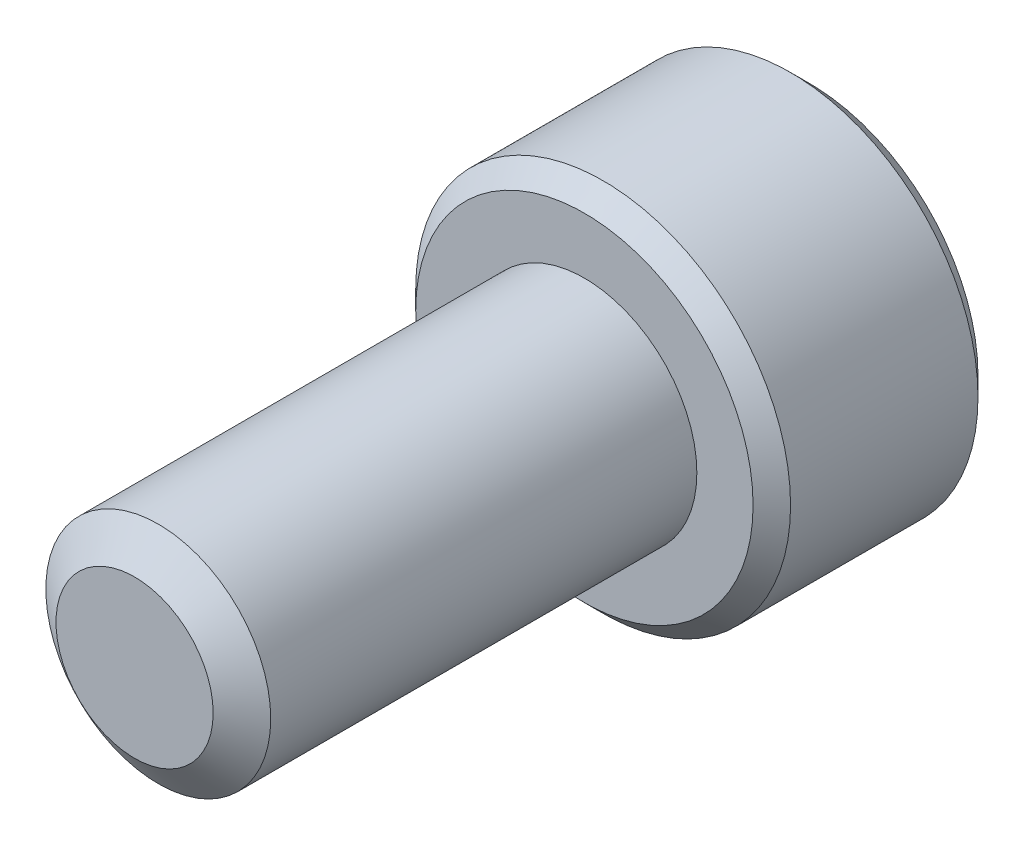
ISO-10303-21;
HEADER;
FILE_DESCRIPTION(('STEP AP214'),'2;1');
FILE_NAME('part.step','',(''),(''),'','','');
FILE_SCHEMA(('AUTOMOTIVE_DESIGN { 1 0 10303 214 1 1 1 1 }'));
ENDSEC;
DATA;
#1=APPLICATION_CONTEXT('core data for automotive mechanical design processes');
#2=APPLICATION_PROTOCOL_DEFINITION('international standard','automotive_design',2000,#1);
#3=PRODUCT_CONTEXT('',#1,'mechanical');
#4=PRODUCT('Part','Part','',(#3));
#5=PRODUCT_RELATED_PRODUCT_CATEGORY('part','',(#4));
#6=PRODUCT_DEFINITION_FORMATION('','',#4);
#7=PRODUCT_DEFINITION_CONTEXT('part definition',#1,'design');
#8=PRODUCT_DEFINITION('design','',#6,#7);
#9=PRODUCT_DEFINITION_SHAPE('','',#8);
#10=(LENGTH_UNIT() NAMED_UNIT(*) SI_UNIT(.MILLI.,.METRE.));
#11=(NAMED_UNIT(*) PLANE_ANGLE_UNIT() SI_UNIT($,.RADIAN.));
#12=(NAMED_UNIT(*) SI_UNIT($,.STERADIAN.) SOLID_ANGLE_UNIT());
#13=UNCERTAINTY_MEASURE_WITH_UNIT(LENGTH_MEASURE(1.E-05),#10,'distance_accuracy_value','');
#14=(GEOMETRIC_REPRESENTATION_CONTEXT(3) GLOBAL_UNCERTAINTY_ASSIGNED_CONTEXT((#13)) GLOBAL_UNIT_ASSIGNED_CONTEXT((#10,
#11,#12)) REPRESENTATION_CONTEXT('',''));
#15=CARTESIAN_POINT('',(0.,0.,0.));
#16=DIRECTION('',(0.,0.,1.));
#17=DIRECTION('',(1.,0.,0.));
#18=AXIS2_PLACEMENT_3D('',#15,#16,#17);
#19=CARTESIAN_POINT('',(0.,0.,-12.));
#20=DIRECTION('',(0.,0.,1.));
#21=DIRECTION('',(1.,0.,0.));
#22=AXIS2_PLACEMENT_3D('',#19,#20,#21);
#23=CYLINDRICAL_SURFACE('',#22,3.);
#24=CARTESIAN_POINT('',(0.,0.,-12.));
#25=DIRECTION('',(0.,0.,-1.));
#26=DIRECTION('',(-1.,0.,0.));
#27=AXIS2_PLACEMENT_3D('',#24,#25,#26);
#28=CIRCLE('',#27,3.);
#29=CARTESIAN_POINT('',(-3.,0.,-12.));
#30=VERTEX_POINT('',#29);
#31=EDGE_CURVE('E218',#30,#30,#28,.F.);
#32=ORIENTED_EDGE('',*,*,#31,.T.);
#33=EDGE_LOOP('',(#32));
#34=FACE_BOUND('',#33,.T.);
#35=CARTESIAN_POINT('',(0.,0.,-0.632650851713494));
#36=DIRECTION('',(0.,0.,1.));
#37=DIRECTION('',(1.,0.,0.));
#38=AXIS2_PLACEMENT_3D('',#35,#36,#37);
#39=CIRCLE('',#38,3.);
#40=CARTESIAN_POINT('',(3.,0.,-0.632650851713494));
#41=VERTEX_POINT('',#40);
#42=EDGE_CURVE('E112',#41,#41,#39,.T.);
#43=ORIENTED_EDGE('',*,*,#42,.F.);
#44=EDGE_LOOP('',(#43));
#45=FACE_BOUND('',#44,.T.);
#46=ADVANCED_FACE('F38',(#34,#45),#23,.T.);
#47=CARTESIAN_POINT('',(0.,0.,0.));
#48=DIRECTION('',(0.,0.,-1.));
#49=DIRECTION('',(-1.,0.,0.));
#50=AXIS2_PLACEMENT_3D('',#47,#48,#49);
#51=CONICAL_SURFACE('',#50,2.09648094716167,0.959931088596884);
#52=ORIENTED_EDGE('',*,*,#42,.T.);
#53=EDGE_LOOP('',(#52));
#54=FACE_BOUND('',#53,.T.);
#55=CARTESIAN_POINT('',(0.,0.,0.));
#56=DIRECTION('',(0.,0.,1.));
#57=DIRECTION('',(1.,0.,0.));
#58=AXIS2_PLACEMENT_3D('',#55,#56,#57);
#59=CIRCLE('',#58,2.09648094716167);
#60=CARTESIAN_POINT('',(2.09648094716167,0.,0.));
#61=VERTEX_POINT('',#60);
#62=EDGE_CURVE('E216',#61,#61,#59,.T.);
#63=ORIENTED_EDGE('',*,*,#62,.F.);
#64=EDGE_LOOP('',(#63));
#65=FACE_BOUND('',#64,.T.);
#66=ADVANCED_FACE('F199',(#54,#65),#51,.T.);
#67=CARTESIAN_POINT('',(0.,0.,0.));
#68=DIRECTION('',(0.,0.,1.));
#69=DIRECTION('',(1.,0.,0.));
#70=AXIS2_PLACEMENT_3D('',#67,#68,#69);
#71=PLANE('',#70);
#72=ORIENTED_EDGE('',*,*,#62,.T.);
#73=EDGE_LOOP('',(#72));
#74=FACE_BOUND('',#73,.T.);
#75=ADVANCED_FACE('F196',(#74),#71,.T.);
#76=CARTESIAN_POINT('',(0.,0.,-18.));
#77=DIRECTION('',(0.,0.,1.));
#78=DIRECTION('',(1.,0.,0.));
#79=AXIS2_PLACEMENT_3D('',#76,#77,#78);
#80=CYLINDRICAL_SURFACE('',#79,5.);
#81=CARTESIAN_POINT('',(0.,0.,-17.5));
#82=DIRECTION('',(0.,0.,-1.));
#83=DIRECTION('',(-1.,0.,0.));
#84=AXIS2_PLACEMENT_3D('',#81,#82,#83);
#85=CIRCLE('',#84,5.);
#86=CARTESIAN_POINT('',(-5.,0.,-17.5));
#87=VERTEX_POINT('',#86);
#88=EDGE_CURVE('E46',#87,#87,#85,.F.);
#89=ORIENTED_EDGE('',*,*,#88,.T.);
#90=EDGE_LOOP('',(#89));
#91=FACE_BOUND('',#90,.T.);
#92=CARTESIAN_POINT('',(0.,0.,-12.5));
#93=DIRECTION('',(0.,0.,-1.));
#94=DIRECTION('',(-1.,0.,0.));
#95=AXIS2_PLACEMENT_3D('',#92,#93,#94);
#96=CIRCLE('',#95,5.);
#97=CARTESIAN_POINT('',(-5.,0.,-12.5));
#98=VERTEX_POINT('',#97);
#99=EDGE_CURVE('E175',#98,#98,#96,.T.);
#100=ORIENTED_EDGE('',*,*,#99,.T.);
#101=EDGE_LOOP('',(#100));
#102=FACE_BOUND('',#101,.T.);
#103=ADVANCED_FACE('F180',(#91,#102),#80,.T.);
#104=CARTESIAN_POINT('',(0.,0.,-18.));
#105=DIRECTION('',(0.,0.,-1.));
#106=DIRECTION('',(-1.,0.,0.));
#107=AXIS2_PLACEMENT_3D('',#104,#105,#106);
#108=PLANE('',#107);
#109=CARTESIAN_POINT('',(0.,0.,-18.));
#110=DIRECTION('',(0.,0.,-1.));
#111=DIRECTION('',(-1.,0.,0.));
#112=AXIS2_PLACEMENT_3D('',#109,#110,#111);
#113=CIRCLE('',#112,4.5);
#114=CARTESIAN_POINT('',(-4.5,0.,-18.));
#115=VERTEX_POINT('',#114);
#116=EDGE_CURVE('E111',#115,#115,#113,.T.);
#117=ORIENTED_EDGE('',*,*,#116,.T.);
#118=EDGE_LOOP('',(#117));
#119=FACE_BOUND('',#118,.T.);
#120=CARTESIAN_POINT('',(0.,0.,-18.));
#121=DIRECTION('',(0.,0.,-1.));
#122=DIRECTION('',(-1.,0.,0.));
#123=AXIS2_PLACEMENT_3D('',#120,#121,#122);
#124=CIRCLE('',#123,2.88675134594813);
#125=CARTESIAN_POINT('',(-2.5,1.44337567297406,-18.));
#126=VERTEX_POINT('',#125);
#127=CARTESIAN_POINT('',(0.,2.88675134594813,-18.));
#128=VERTEX_POINT('',#127);
#129=EDGE_CURVE('E92',#126,#128,#124,.T.);
#130=ORIENTED_EDGE('',*,*,#129,.F.);
#131=CARTESIAN_POINT('',(-2.5,-1.44337567297406,-18.));
#132=VERTEX_POINT('',#131);
#133=EDGE_CURVE('E52',#132,#126,#124,.T.);
#134=ORIENTED_EDGE('',*,*,#133,.F.);
#135=CARTESIAN_POINT('',(0.,-2.88675134594813,-18.));
#136=VERTEX_POINT('',#135);
#137=EDGE_CURVE('E277',#136,#132,#124,.T.);
#138=ORIENTED_EDGE('',*,*,#137,.F.);
#139=CARTESIAN_POINT('',(2.5,-1.44337567297406,-18.));
#140=VERTEX_POINT('',#139);
#141=EDGE_CURVE('E59',#140,#136,#124,.T.);
#142=ORIENTED_EDGE('',*,*,#141,.F.);
#143=CARTESIAN_POINT('',(2.5,1.44337567297407,-18.));
#144=VERTEX_POINT('',#143);
#145=EDGE_CURVE('E133',#144,#140,#124,.T.);
#146=ORIENTED_EDGE('',*,*,#145,.F.);
#147=EDGE_CURVE('E101',#128,#144,#124,.T.);
#148=ORIENTED_EDGE('',*,*,#147,.F.);
#149=EDGE_LOOP('',(#130,#134,#138,#142,#146,#148));
#150=FACE_BOUND('',#149,.T.);
#151=ADVANCED_FACE('F132',(#119,#150),#108,.T.);
#152=CARTESIAN_POINT('',(0.,0.,-12.));
#153=DIRECTION('',(0.,0.,-1.));
#154=DIRECTION('',(-1.,0.,0.));
#155=AXIS2_PLACEMENT_3D('',#152,#153,#154);
#156=PLANE('',#155);
#157=CARTESIAN_POINT('',(0.,0.,-12.));
#158=DIRECTION('',(0.,0.,-1.));
#159=DIRECTION('',(-1.,0.,0.));
#160=AXIS2_PLACEMENT_3D('',#157,#158,#159);
#161=CIRCLE('',#160,4.49999999999999);
#162=CARTESIAN_POINT('',(-4.49999999999999,0.,-12.));
#163=VERTEX_POINT('',#162);
#164=EDGE_CURVE('E11',#163,#163,#161,.F.);
#165=ORIENTED_EDGE('',*,*,#164,.T.);
#166=EDGE_LOOP('',(#165));
#167=FACE_BOUND('',#166,.T.);
#168=ORIENTED_EDGE('',*,*,#31,.F.);
#169=EDGE_LOOP('',(#168));
#170=FACE_BOUND('',#169,.T.);
#171=ADVANCED_FACE('F189',(#167,#170),#156,.F.);
#172=CARTESIAN_POINT('',(0.,0.,-18.));
#173=DIRECTION('',(0.,0.,-1.));
#174=DIRECTION('',(-1.,0.,0.));
#175=AXIS2_PLACEMENT_3D('',#172,#173,#174);
#176=CONICAL_SURFACE('',#175,2.88675134594813,0.78539816339745);
#177=ORIENTED_EDGE('',*,*,#147,.T.);
#178=CARTESIAN_POINT('',(-0.000200000000000267,2.88686681600197,-18.0001154769818));
#179=CARTESIAN_POINT('',(0.0857382777877644,2.83725032818751,-17.9505407053547));
#180=CARTESIAN_POINT('',(0.173113567275753,2.7868041812811,-17.9038774813625));
#181=CARTESIAN_POINT('',(0.351281456165589,2.6839389026696,-17.8184381400383));
#182=CARTESIAN_POINT('',(0.442091000681075,2.6315099876986,-17.779709562406));
#183=CARTESIAN_POINT('',(0.625204123126921,2.52578957716234,-17.7133667038977));
#184=CARTESIAN_POINT('',(0.717461064529341,2.47252500720904,-17.6855856685309));
#185=CARTESIAN_POINT('',(0.904006008776286,2.3648232334321,-17.6427831759107));
#186=CARTESIAN_POINT('',(0.998288312566283,2.31038931995913,-17.6277297666713));
#187=CARTESIAN_POINT('',(1.16077825829185,2.21657570605387,-17.6141477222095));
#188=CARTESIAN_POINT('',(1.22877596788015,2.17731721011878,-17.6121370992408));
#189=CARTESIAN_POINT('',(1.36466024116922,2.0988643883567,-17.6155241171875));
#190=CARTESIAN_POINT('',(1.43254675755224,2.05967008984862,-17.6209243552998));
#191=CARTESIAN_POINT('',(1.56767878823611,1.98165157555715,-17.6388257884025));
#192=CARTESIAN_POINT('',(1.63492349975356,1.94282782326097,-17.6513349270465));
#193=CARTESIAN_POINT('',(1.7682501008182,1.86585167424616,-17.6827675019557));
#194=CARTESIAN_POINT('',(1.83433207909966,1.82769922629678,-17.7016904464968));
#195=CARTESIAN_POINT('',(2.00359634669126,1.72997445583858,-17.7578673614083));
#196=CARTESIAN_POINT('',(2.10572912222289,1.67100807039231,-17.7993558315962));
#197=CARTESIAN_POINT('',(2.25590641494051,1.58430317001562,-17.8693940467231));
#198=CARTESIAN_POINT('',(2.30539653988261,1.55573003305807,-17.8940022521161));
#199=CARTESIAN_POINT('',(2.40346006383885,1.49911303110426,-17.9454618867152));
#200=CARTESIAN_POINT('',(2.45203400349693,1.47106885396706,-17.9723119387794));
#201=CARTESIAN_POINT('',(2.5002,1.44326020292023,-18.0001154769818));
#202=B_SPLINE_CURVE_WITH_KNOTS('',3,(#178,#179,#180,#181,#182,#183,#184,#185,#186,#187,#188,
#189,#190,#191,#192,#193,#194,#195,#196,#197,#198,#199,#200,#201),.UNSPECIFIED.,.F.,.F.,(4,2,2,
2,2,2,2,2,2,2,2,4),(0.,0.333012085133925,0.667964518301398,0.9975970320433,1.32639954393844,
1.56169424147169,1.79707142102083,2.03271213522171,2.26833478775651,2.64260240809533,
2.82922877818864,3.01574133749025),.UNSPECIFIED.);
#203=EDGE_CURVE('E106',#128,#144,#202,.T.);
#204=ORIENTED_EDGE('',*,*,#203,.F.);
#205=EDGE_LOOP('',(#177,#204));
#206=FACE_BOUND('',#205,.T.);
#207=ADVANCED_FACE('F107',(#206),#176,.F.);
#208=ORIENTED_EDGE('',*,*,#145,.T.);
#209=CARTESIAN_POINT('',(2.5,-2.87868021616154,-18.9259641937847));
#210=CARTESIAN_POINT('',(2.5,-2.80858751756355,-18.8730547693995));
#211=CARTESIAN_POINT('',(2.5,-2.73810237384457,-18.8206567848064));
#212=CARTESIAN_POINT('',(2.5,-2.59619238907469,-18.7171126835152));
#213=CARTESIAN_POINT('',(2.5,-2.52476731657143,-18.6659668843779));
#214=CARTESIAN_POINT('',(2.5,-2.38030019419698,-18.5647924979814));
#215=CARTESIAN_POINT('',(2.5,-2.30724990359399,-18.5147756377845));
#216=CARTESIAN_POINT('',(2.5,-2.15990937397294,-18.4166088439155));
#217=CARTESIAN_POINT('',(2.5,-2.08561922308943,-18.3684587783455));
#218=CARTESIAN_POINT('',(2.5,-1.93130274871409,-18.271746559452));
#219=CARTESIAN_POINT('',(2.5,-1.8511916849785,-18.2233189325373));
#220=CARTESIAN_POINT('',(2.5,-1.68912282627168,-18.1296640597041));
#221=CARTESIAN_POINT('',(2.5,-1.60716527674864,-18.0844363916948));
#222=CARTESIAN_POINT('',(2.5,-1.44137668632319,-17.9981353746693));
#223=CARTESIAN_POINT('',(2.5,-1.35755175925796,-17.9570503726636));
#224=CARTESIAN_POINT('',(2.5,-1.1876157775942,-17.8799618661066));
#225=CARTESIAN_POINT('',(2.5,-1.10150577924729,-17.8439560607346));
#226=CARTESIAN_POINT('',(2.5,-0.933895283730373,-17.7809497442851));
#227=CARTESIAN_POINT('',(2.5,-0.852581486652411,-17.7534577201431));
#228=CARTESIAN_POINT('',(2.5,-0.687996185051425,-17.7049971144174));
#229=CARTESIAN_POINT('',(2.5,-0.604724546085162,-17.684028982239));
#230=CARTESIAN_POINT('',(2.5,-0.438105786501649,-17.650059995013));
#231=CARTESIAN_POINT('',(2.5,-0.354786957377881,-17.6369226334436));
#232=CARTESIAN_POINT('',(2.5,-0.187258638268771,-17.6188701943996));
#233=CARTESIAN_POINT('',(2.5,-0.103049303891732,-17.6139537035302));
#234=CARTESIAN_POINT('',(2.5,0.0623819458555499,-17.6127080743719));
#235=CARTESIAN_POINT('',(2.5,0.143601667742495,-17.6160745517109));
#236=CARTESIAN_POINT('',(2.5,0.305344840533965,-17.6305375923809));
#237=CARTESIAN_POINT('',(2.5,0.385868223029658,-17.6416349066531));
#238=CARTESIAN_POINT('',(2.5,0.546999992477731,-17.6711420785853));
#239=CARTESIAN_POINT('',(2.5,0.627585258156381,-17.6896763768309));
#240=CARTESIAN_POINT('',(2.5,0.786991930978589,-17.7330723320141));
#241=CARTESIAN_POINT('',(2.5,0.865813485110826,-17.7579334595174));
#242=CARTESIAN_POINT('',(2.5,1.11399280220491,-17.8455589112399));
#243=CARTESIAN_POINT('',(2.5,1.27984027529456,-17.9183033354746));
#244=CARTESIAN_POINT('',(2.5,1.52253018655038,-18.0395423452678));
#245=CARTESIAN_POINT('',(2.5,1.60256472908879,-18.0820714512072));
#246=CARTESIAN_POINT('',(2.5,1.76081489282125,-18.1703965241522));
#247=CARTESIAN_POINT('',(2.5,1.83903083842887,-18.2161919024767));
#248=CARTESIAN_POINT('',(2.5,1.99000684607168,-18.3080446787287));
#249=CARTESIAN_POINT('',(2.5,2.06284472030444,-18.3539756354245));
#250=CARTESIAN_POINT('',(2.5,2.20727164736135,-18.4477702453865));
#251=CARTESIAN_POINT('',(2.5,2.27886060500402,-18.4956340450436));
#252=CARTESIAN_POINT('',(2.5,2.42037078548403,-18.5925522363183));
#253=CARTESIAN_POINT('',(2.5,2.49030083172878,-18.6415937983162));
#254=CARTESIAN_POINT('',(2.5,2.62920524991558,-18.7409738351898));
#255=CARTESIAN_POINT('',(2.5,2.69817987937839,-18.7913119497074));
#256=CARTESIAN_POINT('',(2.5,2.76675463365823,-18.8421802976824));
#257=B_SPLINE_CURVE_WITH_KNOTS('',3,(#209,#210,#211,#212,#213,#214,#215,#216,#217,#218,#219,
#220,#221,#222,#223,#224,#225,#226,#227,#228,#229,#230,#231,#232,#233,#234,#235,#236,#237,#238,
#239,#240,#241,#242,#243,#244,#245,#246,#247,#248,#249,#250,#251,#252,#253,#254,#255,#256),
.UNSPECIFIED.,.F.,.F.,(4,2,2,2,2,2,2,2,2,2,2,2,2,2,2,2,2,2,2,2,2,2,2,4),(0.,0.263465914971113,
0.526997968323236,0.792571943279359,1.05812711983771,1.33890112548018,1.61963802629078,
1.89956181222215,2.17935838571897,2.436638876826,2.69393708705247,2.94660788173134,
3.19923523085015,3.44271854486786,3.68622551313359,3.93398926860573,4.18173229781968,
4.72334004841907,4.99521600382014,5.26704308216966,5.52534341671993,5.78366335141086,
6.03988492204046,6.29603603207541),.UNSPECIFIED.);
#258=EDGE_CURVE('E100',#144,#140,#257,.F.);
#259=ORIENTED_EDGE('',*,*,#258,.F.);
#260=EDGE_LOOP('',(#208,#259));
#261=FACE_BOUND('',#260,.T.);
#262=ADVANCED_FACE('F283',(#261),#176,.F.);
#263=ORIENTED_EDGE('',*,*,#141,.T.);
#264=CARTESIAN_POINT('',(2.5002,-1.44326020292023,-18.0001154769818));
#265=CARTESIAN_POINT('',(2.41426172221224,-1.49287669073469,-17.9505407053547));
#266=CARTESIAN_POINT('',(2.32688643272425,-1.5433228376411,-17.9038774813625));
#267=CARTESIAN_POINT('',(2.14871854383441,-1.64618811625259,-17.8184381400383));
#268=CARTESIAN_POINT('',(2.05790899931892,-1.6986170312236,-17.779709562406));
#269=CARTESIAN_POINT('',(1.87479587687308,-1.80433744175986,-17.7133667038977));
#270=CARTESIAN_POINT('',(1.78253893547066,-1.85760201171316,-17.6855856685309));
#271=CARTESIAN_POINT('',(1.59599399122371,-1.96530378549009,-17.6427831759107));
#272=CARTESIAN_POINT('',(1.50171168743372,-2.01973769896307,-17.6277297666713));
#273=CARTESIAN_POINT('',(1.33922174170815,-2.11355131286833,-17.6141477222095));
#274=CARTESIAN_POINT('',(1.27122403211985,-2.15280980880341,-17.6121370992408));
#275=CARTESIAN_POINT('',(1.13533975883078,-2.23126263056549,-17.6155241171875));
#276=CARTESIAN_POINT('',(1.06745324244776,-2.27045692907358,-17.6209243552998));
#277=CARTESIAN_POINT('',(0.932321211763892,-2.34847544336505,-17.6388257884025));
#278=CARTESIAN_POINT('',(0.865076500246437,-2.38729919566123,-17.6513349270465));
#279=CARTESIAN_POINT('',(0.731749899181799,-2.46427534467604,-17.6827675019557));
#280=CARTESIAN_POINT('',(0.66566792090034,-2.50242779262542,-17.7016904464968));
#281=CARTESIAN_POINT('',(0.496403653308733,-2.60015256308362,-17.7578673614083));
#282=CARTESIAN_POINT('',(0.394270877777106,-2.65911894852989,-17.7993558315962));
#283=CARTESIAN_POINT('',(0.244093585059491,-2.74582384890657,-17.8693940467231));
#284=CARTESIAN_POINT('',(0.194603460117391,-2.77439698586412,-17.8940022521161));
#285=CARTESIAN_POINT('',(0.0965399361611534,-2.83101398781794,-17.9454618867152));
#286=CARTESIAN_POINT('',(0.0479659965030722,-2.85905816495513,-17.9723119387794));
#287=CARTESIAN_POINT('',(-0.00019999999999949,-2.88686681600197,-18.0001154769818));
#288=B_SPLINE_CURVE_WITH_KNOTS('',3,(#264,#265,#266,#267,#268,#269,#270,#271,#272,#273,#274,
#275,#276,#277,#278,#279,#280,#281,#282,#283,#284,#285,#286,#287),.UNSPECIFIED.,.F.,.F.,(4,2,2,
2,2,2,2,2,2,2,2,4),(0.,0.333012085133925,0.6679645183014,0.997597032043302,1.32639954393845,
1.56169424147169,1.79707142102083,2.03271213522171,2.26833478775651,2.64260240809533,
2.82922877818864,3.01574133749025),.UNSPECIFIED.);
#289=EDGE_CURVE('E143',#140,#136,#288,.T.);
#290=ORIENTED_EDGE('',*,*,#289,.F.);
#291=EDGE_LOOP('',(#263,#290));
#292=FACE_BOUND('',#291,.T.);
#293=ADVANCED_FACE('F280',(#292),#176,.F.);
#294=ORIENTED_EDGE('',*,*,#137,.T.);
#295=CARTESIAN_POINT('',(0.000200000000000386,-2.88686681600197,-18.0001154769818));
#296=CARTESIAN_POINT('',(-0.0857382777877645,-2.83725032818751,-17.9505407053547));
#297=CARTESIAN_POINT('',(-0.173113567275753,-2.7868041812811,-17.9038774813625));
#298=CARTESIAN_POINT('',(-0.351281456165589,-2.6839389026696,-17.8184381400383));
#299=CARTESIAN_POINT('',(-0.442091000681075,-2.6315099876986,-17.779709562406));
#300=CARTESIAN_POINT('',(-0.625204123126921,-2.52578957716234,-17.7133667038977));
#301=CARTESIAN_POINT('',(-0.717461064529341,-2.47252500720904,-17.6855856685309));
#302=CARTESIAN_POINT('',(-0.904006008776286,-2.3648232334321,-17.6427831759107));
#303=CARTESIAN_POINT('',(-0.998288312566283,-2.31038931995913,-17.6277297666713));
#304=CARTESIAN_POINT('',(-1.16077825829185,-2.21657570605387,-17.6141477222095));
#305=CARTESIAN_POINT('',(-1.22877596788015,-2.17731721011878,-17.6121370992408));
#306=CARTESIAN_POINT('',(-1.36466024116922,-2.0988643883567,-17.6155241171875));
#307=CARTESIAN_POINT('',(-1.43254675755224,-2.05967008984862,-17.6209243552998));
#308=CARTESIAN_POINT('',(-1.56767878823611,-1.98165157555715,-17.6388257884025));
#309=CARTESIAN_POINT('',(-1.63492349975356,-1.94282782326097,-17.6513349270465));
#310=CARTESIAN_POINT('',(-1.7682501008182,-1.86585167424616,-17.6827675019557));
#311=CARTESIAN_POINT('',(-1.83433207909966,-1.82769922629678,-17.7016904464968));
#312=CARTESIAN_POINT('',(-2.00359634669126,-1.72997445583858,-17.7578673614083));
#313=CARTESIAN_POINT('',(-2.10572912222289,-1.67100807039231,-17.7993558315962));
#314=CARTESIAN_POINT('',(-2.25590641494051,-1.58430317001562,-17.8693940467231));
#315=CARTESIAN_POINT('',(-2.30539653988261,-1.55573003305807,-17.8940022521161));
#316=CARTESIAN_POINT('',(-2.40346006383885,-1.49911303110426,-17.9454618867152));
#317=CARTESIAN_POINT('',(-2.45203400349693,-1.47106885396706,-17.9723119387794));
#318=CARTESIAN_POINT('',(-2.5002,-1.44326020292023,-18.0001154769818));
#319=B_SPLINE_CURVE_WITH_KNOTS('',3,(#295,#296,#297,#298,#299,#300,#301,#302,#303,#304,#305,
#306,#307,#308,#309,#310,#311,#312,#313,#314,#315,#316,#317,#318),.UNSPECIFIED.,.F.,.F.,(4,2,2,
2,2,2,2,2,2,2,2,4),(0.,0.333012085133925,0.667964518301399,0.997597032043301,1.32639954393844,
1.56169424147169,1.79707142102083,2.03271213522171,2.26833478775651,2.64260240809533,
2.82922877818864,3.01574133749025),.UNSPECIFIED.);
#320=EDGE_CURVE('E254',#136,#132,#319,.T.);
#321=ORIENTED_EDGE('',*,*,#320,.F.);
#322=EDGE_LOOP('',(#294,#321));
#323=FACE_BOUND('',#322,.T.);
#324=ADVANCED_FACE('F279',(#323),#176,.F.);
#325=ORIENTED_EDGE('',*,*,#133,.T.);
#326=CARTESIAN_POINT('',(-2.5,-2.87868021658037,-18.9259641941009));
#327=CARTESIAN_POINT('',(-2.5,-2.80858751797063,-18.8730547697035));
#328=CARTESIAN_POINT('',(-2.5,-2.73810237423987,-18.8206567850983));
#329=CARTESIAN_POINT('',(-2.5,-2.59619238944629,-18.7171126837829));
#330=CARTESIAN_POINT('',(-2.5,-2.52476731693112,-18.6659668846335));
#331=CARTESIAN_POINT('',(-2.5,-2.38030019453245,-18.5647924982127));
#332=CARTESIAN_POINT('',(-2.5,-2.30724990391715,-18.5147756380036));
#333=CARTESIAN_POINT('',(-2.5,-2.15990937427125,-18.4166088441105));
#334=CARTESIAN_POINT('',(-2.5,-2.08561922337521,-18.3684587785285));
#335=CARTESIAN_POINT('',(-2.5,-1.93130274897283,-18.27174655961));
#336=CARTESIAN_POINT('',(-2.5,-1.85119168522271,-18.2233189326825));
#337=CARTESIAN_POINT('',(-2.5,-1.6891228264863,-18.1296640598241));
#338=CARTESIAN_POINT('',(-2.5,-1.60716527694821,-18.0844363918025));
#339=CARTESIAN_POINT('',(-2.5,-1.44137668649212,-17.9981353747534));
#340=CARTESIAN_POINT('',(-2.5,-1.35755175941129,-17.9570503727365));
#341=CARTESIAN_POINT('',(-2.5,-1.18761577771552,-17.8799618661583));
#342=CARTESIAN_POINT('',(-2.5,-1.10150577935218,-17.8439560607764));
#343=CARTESIAN_POINT('',(-2.5,-0.933895283828168,-17.7809497443196));
#344=CARTESIAN_POINT('',(-2.5,-0.852581486760255,-17.7534577201783));
#345=CARTESIAN_POINT('',(-2.5,-0.687996185179695,-17.7049971144518));
#346=CARTESIAN_POINT('',(-2.5,-0.604724546223809,-17.6840289822719));
#347=CARTESIAN_POINT('',(-2.5,-0.438105786660707,-17.6500599950408));
#348=CARTESIAN_POINT('',(-2.5,-0.354786957546968,-17.6369226334677));
#349=CARTESIAN_POINT('',(-2.5,-0.187258638457583,-17.6188701944141));
#350=CARTESIAN_POINT('',(-2.5,-0.103049304090237,-17.6139537035387));
#351=CARTESIAN_POINT('',(-2.5,0.0623819456391586,-17.6127080743668));
#352=CARTESIAN_POINT('',(-2.5,0.143601667517887,-17.6160745516982));
#353=CARTESIAN_POINT('',(-2.5,0.305344840293745,-17.630537592352));
#354=CARTESIAN_POINT('',(-2.5,0.385868222782044,-17.6416349066155));
#355=CARTESIAN_POINT('',(-2.5,0.546999992215519,-17.6711420785295));
#356=CARTESIAN_POINT('',(-2.5,0.627585257886986,-17.6896763767654));
#357=CARTESIAN_POINT('',(-2.5,0.786991930695525,-17.7330723319292));
#358=CARTESIAN_POINT('',(-2.5,0.865813484821274,-17.7579334594227));
#359=CARTESIAN_POINT('',(-2.5,1.1139928018523,-17.8455589110989));
#360=CARTESIAN_POINT('',(-2.5,1.27984027488853,-17.9183033352911));
#361=CARTESIAN_POINT('',(-2.5,1.52253018606745,-18.039542345017));
#362=CARTESIAN_POINT('',(-2.5,1.60256472858067,-18.0820714509332));
#363=CARTESIAN_POINT('',(-2.5,1.76081489226356,-18.1703965238313));
#364=CARTESIAN_POINT('',(-2.5,1.8390308378468,-18.216191902132));
#365=CARTESIAN_POINT('',(-2.5,1.99000684544531,-18.3080446783387));
#366=CARTESIAN_POINT('',(-2.5,2.06284471965806,-18.3539756350131));
#367=CARTESIAN_POINT('',(-2.5,2.20727164667524,-18.4477702449325));
#368=CARTESIAN_POINT('',(-2.5,2.27886060429818,-18.4956340445682));
#369=CARTESIAN_POINT('',(-2.5,2.42037078473922,-18.5925522358003));
#370=CARTESIAN_POINT('',(-2.5,2.49030083096472,-18.641593797777));
#371=CARTESIAN_POINT('',(-2.5,2.62920524911314,-18.7409738346083));
#372=CARTESIAN_POINT('',(-2.5,2.69817987855683,-18.7913119491048));
#373=CARTESIAN_POINT('',(-2.5,2.76675463281757,-18.8421802970587));
#374=B_SPLINE_CURVE_WITH_KNOTS('',3,(#326,#327,#328,#329,#330,#331,#332,#333,#334,#335,#336,
#337,#338,#339,#340,#341,#342,#343,#344,#345,#346,#347,#348,#349,#350,#351,#352,#353,#354,#355,
#356,#357,#358,#359,#360,#361,#362,#363,#364,#365,#366,#367,#368,#369,#370,#371,#372,#373),
.UNSPECIFIED.,.F.,.F.,(4,2,2,2,2,2,2,2,2,2,2,2,2,2,2,2,2,2,2,2,2,2,2,4),(0.,0.263465915021263,
0.526997968423548,0.792571943430777,1.05812712004023,1.33890112574002,1.61963802660793,
1.89956181259616,2.17935838614973,2.43663887722771,2.69393708742518,2.94660788207623,
3.19923523116721,3.44271854515945,3.6862255133997,3.93398926884439,4.18173229803092,
4.72334004843316,4.99521600373497,5.26704308198527,5.52534341645065,5.78366335105668,
6.03988492160254,6.29603603155374),.UNSPECIFIED.);
#375=EDGE_CURVE('E122',#132,#126,#374,.T.);
#376=ORIENTED_EDGE('',*,*,#375,.F.);
#377=EDGE_LOOP('',(#325,#376));
#378=FACE_BOUND('',#377,.T.);
#379=ADVANCED_FACE('F292',(#378),#176,.F.);
#380=ORIENTED_EDGE('',*,*,#129,.T.);
#381=CARTESIAN_POINT('',(-2.5002,1.44326020292023,-18.0001154769818));
#382=CARTESIAN_POINT('',(-2.41426172221224,1.49287669073469,-17.9505407053547));
#383=CARTESIAN_POINT('',(-2.32688643272425,1.5433228376411,-17.9038774813625));
#384=CARTESIAN_POINT('',(-2.14871854383441,1.64618811625259,-17.8184381400383));
#385=CARTESIAN_POINT('',(-2.05790899931892,1.69861703122359,-17.779709562406));
#386=CARTESIAN_POINT('',(-1.87479587687308,1.80433744175986,-17.7133667038977));
#387=CARTESIAN_POINT('',(-1.78253893547066,1.85760201171316,-17.6855856685309));
#388=CARTESIAN_POINT('',(-1.59599399122371,1.96530378549009,-17.6427831759107));
#389=CARTESIAN_POINT('',(-1.50171168743372,2.01973769896307,-17.6277297666713));
#390=CARTESIAN_POINT('',(-1.33922174170815,2.11355131286833,-17.6141477222095));
#391=CARTESIAN_POINT('',(-1.27122403211985,2.15280980880341,-17.6121370992408));
#392=CARTESIAN_POINT('',(-1.13533975883078,2.23126263056549,-17.6155241171875));
#393=CARTESIAN_POINT('',(-1.06745324244776,2.27045692907358,-17.6209243552998));
#394=CARTESIAN_POINT('',(-0.932321211763892,2.34847544336505,-17.6388257884025));
#395=CARTESIAN_POINT('',(-0.865076500246438,2.38729919566123,-17.6513349270465));
#396=CARTESIAN_POINT('',(-0.731749899181799,2.46427534467604,-17.6827675019557));
#397=CARTESIAN_POINT('',(-0.665667920900341,2.50242779262542,-17.7016904464968));
#398=CARTESIAN_POINT('',(-0.496403653308734,2.60015256308362,-17.7578673614083));
#399=CARTESIAN_POINT('',(-0.394270877777106,2.65911894852989,-17.7993558315962));
#400=CARTESIAN_POINT('',(-0.24409358505949,2.74582384890657,-17.8693940467231));
#401=CARTESIAN_POINT('',(-0.19460346011739,2.77439698586412,-17.8940022521161));
#402=CARTESIAN_POINT('',(-0.0965399361611524,2.83101398781794,-17.9454618867152));
#403=CARTESIAN_POINT('',(-0.0479659965030713,2.85905816495513,-17.9723119387794));
#404=CARTESIAN_POINT('',(0.000200000000000194,2.88686681600197,-18.0001154769818));
#405=B_SPLINE_CURVE_WITH_KNOTS('',3,(#381,#382,#383,#384,#385,#386,#387,#388,#389,#390,#391,
#392,#393,#394,#395,#396,#397,#398,#399,#400,#401,#402,#403,#404),.UNSPECIFIED.,.F.,.F.,(4,2,2,
2,2,2,2,2,2,2,2,4),(0.,0.333012085133926,0.6679645183014,0.997597032043303,1.32639954393845,
1.56169424147169,1.79707142102083,2.03271213522171,2.26833478775651,2.64260240809533,
2.82922877818864,3.01574133749025),.UNSPECIFIED.);
#406=EDGE_CURVE('E96',#126,#128,#405,.T.);
#407=ORIENTED_EDGE('',*,*,#406,.F.);
#408=EDGE_LOOP('',(#380,#407));
#409=FACE_BOUND('',#408,.T.);
#410=ADVANCED_FACE('F94',(#409),#176,.F.);
#411=CARTESIAN_POINT('',(2.5,4.33012701892219,-14.25));
#412=DIRECTION('',(0.,0.,-1.));
#413=DIRECTION('',(-1.,0.,0.));
#414=AXIS2_PLACEMENT_3D('',#411,#412,#413);
#415=PLANE('',#414);
#416=DIRECTION('',(0.866025403784439,0.5,0.));
#417=VECTOR('',#416,1.);
#418=CARTESIAN_POINT('',(-2.5,1.44337567297406,-14.25));
#419=LINE('',#418,#417);
#420=CARTESIAN_POINT('',(-2.5,1.44337567297406,-14.25));
#421=VERTEX_POINT('',#420);
#422=CARTESIAN_POINT('',(0.,2.88675134594813,-14.25));
#423=VERTEX_POINT('',#422);
#424=EDGE_CURVE('E121',#421,#423,#419,.T.);
#425=ORIENTED_EDGE('',*,*,#424,.T.);
#426=DIRECTION('',(0.866025403784439,-0.5,0.));
#427=VECTOR('',#426,1.);
#428=CARTESIAN_POINT('',(0.,2.88675134594813,-14.25));
#429=LINE('',#428,#427);
#430=CARTESIAN_POINT('',(2.5,1.44337567297406,-14.25));
#431=VERTEX_POINT('',#430);
#432=EDGE_CURVE('E126',#423,#431,#429,.T.);
#433=ORIENTED_EDGE('',*,*,#432,.T.);
#434=DIRECTION('',(0.,-1.,0.));
#435=VECTOR('',#434,1.);
#436=CARTESIAN_POINT('',(2.5,1.44337567297406,-14.25));
#437=LINE('',#436,#435);
#438=CARTESIAN_POINT('',(2.5,-1.44337567297407,-14.25));
#439=VERTEX_POINT('',#438);
#440=EDGE_CURVE('E240',#431,#439,#437,.T.);
#441=ORIENTED_EDGE('',*,*,#440,.T.);
#442=DIRECTION('',(-0.866025403784439,-0.5,0.));
#443=VECTOR('',#442,1.);
#444=CARTESIAN_POINT('',(2.5,-1.44337567297407,-14.25));
#445=LINE('',#444,#443);
#446=CARTESIAN_POINT('',(0.,-2.88675134594813,-14.25));
#447=VERTEX_POINT('',#446);
#448=EDGE_CURVE('E237',#439,#447,#445,.T.);
#449=ORIENTED_EDGE('',*,*,#448,.T.);
#450=DIRECTION('',(-0.866025403784439,0.5,0.));
#451=VECTOR('',#450,1.);
#452=CARTESIAN_POINT('',(0.,-2.88675134594813,-14.25));
#453=LINE('',#452,#451);
#454=CARTESIAN_POINT('',(-2.5,-1.44337567297406,-14.25));
#455=VERTEX_POINT('',#454);
#456=EDGE_CURVE('E234',#447,#455,#453,.T.);
#457=ORIENTED_EDGE('',*,*,#456,.T.);
#458=DIRECTION('',(0.,1.,0.));
#459=VECTOR('',#458,1.);
#460=CARTESIAN_POINT('',(-2.5,-1.44337567297406,-14.25));
#461=LINE('',#460,#459);
#462=EDGE_CURVE('E129',#455,#421,#461,.T.);
#463=ORIENTED_EDGE('',*,*,#462,.T.);
#464=EDGE_LOOP('',(#425,#433,#441,#449,#457,#463));
#465=FACE_BOUND('',#464,.T.);
#466=ADVANCED_FACE('F163',(#465),#415,.T.);
#467=CARTESIAN_POINT('',(0.,2.88675134594813,-14.25));
#468=DIRECTION('',(0.5,0.866025403784439,0.));
#469=DIRECTION('',(-0.866025403784439,0.5,0.));
#470=AXIS2_PLACEMENT_3D('',#467,#468,#469);
#471=PLANE('',#470);
#472=DIRECTION('',(0.,0.,-1.));
#473=VECTOR('',#472,1.);
#474=CARTESIAN_POINT('',(0.,2.88675134594813,-14.25));
#475=LINE('',#474,#473);
#476=EDGE_CURVE('E118',#423,#128,#475,.T.);
#477=ORIENTED_EDGE('',*,*,#476,.T.);
#478=ORIENTED_EDGE('',*,*,#203,.T.);
#479=DIRECTION('',(0.,0.,-1.));
#480=VECTOR('',#479,1.);
#481=CARTESIAN_POINT('',(2.5,1.44337567297406,-14.25));
#482=LINE('',#481,#480);
#483=EDGE_CURVE('E128',#431,#144,#482,.T.);
#484=ORIENTED_EDGE('',*,*,#483,.F.);
#485=ORIENTED_EDGE('',*,*,#432,.F.);
#486=EDGE_LOOP('',(#477,#478,#484,#485));
#487=FACE_BOUND('',#486,.T.);
#488=ADVANCED_FACE('F124',(#487),#471,.F.);
#489=CARTESIAN_POINT('',(2.5,1.44337567297406,-14.25));
#490=DIRECTION('',(1.,0.,0.));
#491=DIRECTION('',(0.,0.,-1.));
#492=AXIS2_PLACEMENT_3D('',#489,#490,#491);
#493=PLANE('',#492);
#494=ORIENTED_EDGE('',*,*,#483,.T.);
#495=ORIENTED_EDGE('',*,*,#258,.T.);
#496=DIRECTION('',(0.,0.,-1.));
#497=VECTOR('',#496,1.);
#498=CARTESIAN_POINT('',(2.5,-1.44337567297407,-14.25));
#499=LINE('',#498,#497);
#500=EDGE_CURVE('E223',#439,#140,#499,.T.);
#501=ORIENTED_EDGE('',*,*,#500,.F.);
#502=ORIENTED_EDGE('',*,*,#440,.F.);
#503=EDGE_LOOP('',(#494,#495,#501,#502));
#504=FACE_BOUND('',#503,.T.);
#505=ADVANCED_FACE('F152',(#504),#493,.F.);
#506=CARTESIAN_POINT('',(2.5,-1.44337567297407,-14.25));
#507=DIRECTION('',(0.5,-0.866025403784439,0.));
#508=DIRECTION('',(0.866025403784439,0.5,0.));
#509=AXIS2_PLACEMENT_3D('',#506,#507,#508);
#510=PLANE('',#509);
#511=ORIENTED_EDGE('',*,*,#500,.T.);
#512=ORIENTED_EDGE('',*,*,#289,.T.);
#513=DIRECTION('',(0.,0.,-1.));
#514=VECTOR('',#513,1.);
#515=CARTESIAN_POINT('',(0.,-2.88675134594813,-14.25));
#516=LINE('',#515,#514);
#517=EDGE_CURVE('E226',#447,#136,#516,.T.);
#518=ORIENTED_EDGE('',*,*,#517,.F.);
#519=ORIENTED_EDGE('',*,*,#448,.F.);
#520=EDGE_LOOP('',(#511,#512,#518,#519));
#521=FACE_BOUND('',#520,.T.);
#522=ADVANCED_FACE('F156',(#521),#510,.F.);
#523=CARTESIAN_POINT('',(0.,-2.88675134594813,-14.25));
#524=DIRECTION('',(-0.5,-0.866025403784439,0.));
#525=DIRECTION('',(0.866025403784439,-0.5,0.));
#526=AXIS2_PLACEMENT_3D('',#523,#524,#525);
#527=PLANE('',#526);
#528=ORIENTED_EDGE('',*,*,#517,.T.);
#529=ORIENTED_EDGE('',*,*,#320,.T.);
#530=DIRECTION('',(0.,0.,-1.));
#531=VECTOR('',#530,1.);
#532=CARTESIAN_POINT('',(-2.5,-1.44337567297406,-14.25));
#533=LINE('',#532,#531);
#534=EDGE_CURVE('E229',#455,#132,#533,.T.);
#535=ORIENTED_EDGE('',*,*,#534,.F.);
#536=ORIENTED_EDGE('',*,*,#456,.F.);
#537=EDGE_LOOP('',(#528,#529,#535,#536));
#538=FACE_BOUND('',#537,.T.);
#539=ADVANCED_FACE('F262',(#538),#527,.F.);
#540=CARTESIAN_POINT('',(-2.5,-1.44337567297406,-14.25));
#541=DIRECTION('',(-1.,0.,0.));
#542=DIRECTION('',(0.,-1.,0.));
#543=AXIS2_PLACEMENT_3D('',#540,#541,#542);
#544=PLANE('',#543);
#545=ORIENTED_EDGE('',*,*,#534,.T.);
#546=ORIENTED_EDGE('',*,*,#375,.T.);
#547=DIRECTION('',(0.,0.,-1.));
#548=VECTOR('',#547,1.);
#549=CARTESIAN_POINT('',(-2.5,1.44337567297406,-14.25));
#550=LINE('',#549,#548);
#551=EDGE_CURVE('E120',#421,#126,#550,.T.);
#552=ORIENTED_EDGE('',*,*,#551,.F.);
#553=ORIENTED_EDGE('',*,*,#462,.F.);
#554=EDGE_LOOP('',(#545,#546,#552,#553));
#555=FACE_BOUND('',#554,.T.);
#556=ADVANCED_FACE('F259',(#555),#544,.F.);
#557=CARTESIAN_POINT('',(-2.5,1.44337567297406,-14.25));
#558=DIRECTION('',(-0.5,0.866025403784439,0.));
#559=DIRECTION('',(-0.866025403784439,-0.5,0.));
#560=AXIS2_PLACEMENT_3D('',#557,#558,#559);
#561=PLANE('',#560);
#562=ORIENTED_EDGE('',*,*,#551,.T.);
#563=ORIENTED_EDGE('',*,*,#406,.T.);
#564=ORIENTED_EDGE('',*,*,#476,.F.);
#565=ORIENTED_EDGE('',*,*,#424,.F.);
#566=EDGE_LOOP('',(#562,#563,#564,#565));
#567=FACE_BOUND('',#566,.T.);
#568=ADVANCED_FACE('F116',(#567),#561,.F.);
#569=CARTESIAN_POINT('',(0.,0.,-18.));
#570=DIRECTION('',(0.,0.,1.));
#571=DIRECTION('',(1.,0.,0.));
#572=AXIS2_PLACEMENT_3D('',#569,#570,#571);
#573=CONICAL_SURFACE('',#572,4.5,0.785398163397444);
#574=ORIENTED_EDGE('',*,*,#88,.F.);
#575=EDGE_LOOP('',(#574));
#576=FACE_BOUND('',#575,.T.);
#577=ORIENTED_EDGE('',*,*,#116,.F.);
#578=EDGE_LOOP('',(#577));
#579=FACE_BOUND('',#578,.T.);
#580=ADVANCED_FACE('F183',(#576,#579),#573,.T.);
#581=CARTESIAN_POINT('',(0.,0.,-12.5));
#582=DIRECTION('',(0.,0.,-1.));
#583=DIRECTION('',(-1.,0.,0.));
#584=AXIS2_PLACEMENT_3D('',#581,#582,#583);
#585=CONICAL_SURFACE('',#584,5.,0.785398163397451);
#586=ORIENTED_EDGE('',*,*,#164,.F.);
#587=EDGE_LOOP('',(#586));
#588=FACE_BOUND('',#587,.T.);
#589=ORIENTED_EDGE('',*,*,#99,.F.);
#590=EDGE_LOOP('',(#589));
#591=FACE_BOUND('',#590,.T.);
#592=ADVANCED_FACE('F40',(#588,#591),#585,.T.);
#593=CLOSED_SHELL('',(#46,#66,#75,#103,#151,#171,#207,#262,#293,#324,#379,#410,#466,#488,#505,
#522,#539,#556,#568,#580,#592));
#594=MANIFOLD_SOLID_BREP('B2',#593);
#595=ADVANCED_BREP_SHAPE_REPRESENTATION('',(#18,#594),#14);
#596=SHAPE_DEFINITION_REPRESENTATION(#9,#595);
ENDSEC;
END-ISO-10303-21;
